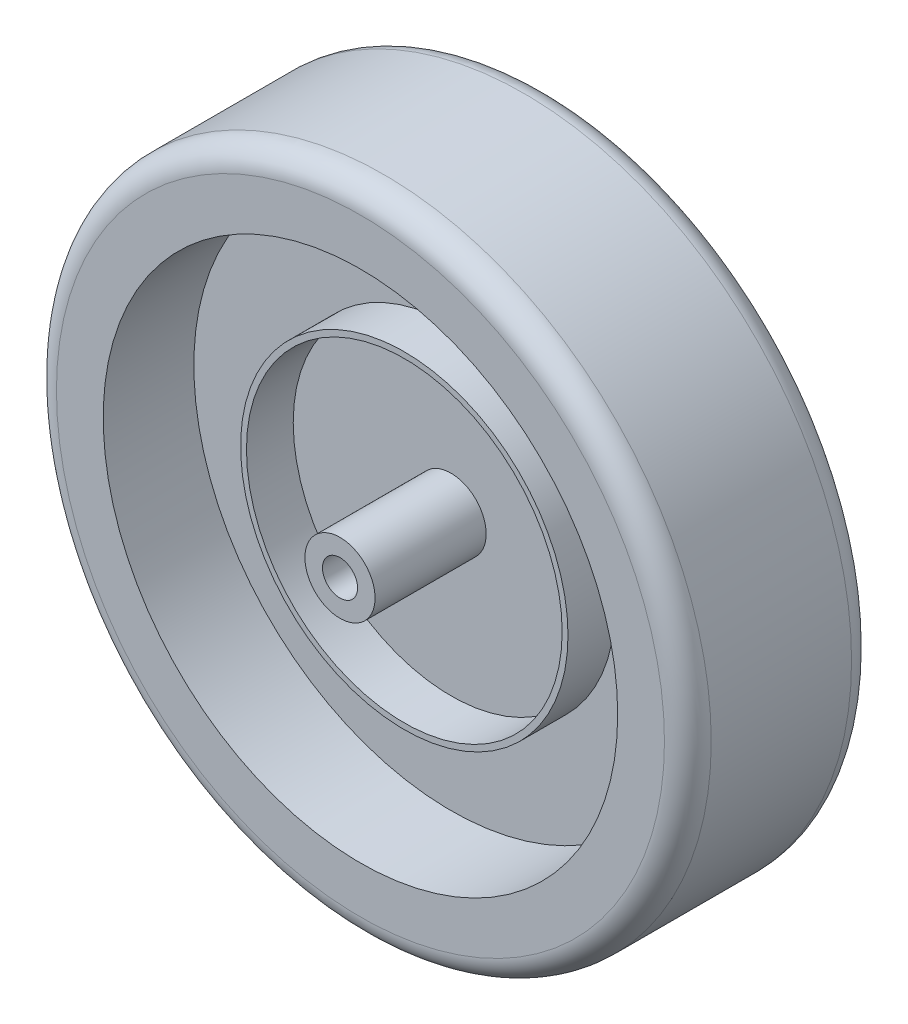
ISO-10303-21;
HEADER;
FILE_DESCRIPTION(('STEP AP214'),'2;1');
FILE_NAME('part.step','',(''),(''),'','','');
FILE_SCHEMA(('AUTOMOTIVE_DESIGN { 1 0 10303 214 1 1 1 1 }'));
ENDSEC;
DATA;
#1=APPLICATION_CONTEXT('core data for automotive mechanical design processes');
#2=APPLICATION_PROTOCOL_DEFINITION('international standard','automotive_design',2000,#1);
#3=PRODUCT_CONTEXT('',#1,'mechanical');
#4=PRODUCT('Part','Part','',(#3));
#5=PRODUCT_RELATED_PRODUCT_CATEGORY('part','',(#4));
#6=PRODUCT_DEFINITION_FORMATION('','',#4);
#7=PRODUCT_DEFINITION_CONTEXT('part definition',#1,'design');
#8=PRODUCT_DEFINITION('design','',#6,#7);
#9=PRODUCT_DEFINITION_SHAPE('','',#8);
#10=(LENGTH_UNIT() NAMED_UNIT(*) SI_UNIT(.MILLI.,.METRE.));
#11=(NAMED_UNIT(*) PLANE_ANGLE_UNIT() SI_UNIT($,.RADIAN.));
#12=(NAMED_UNIT(*) SI_UNIT($,.STERADIAN.) SOLID_ANGLE_UNIT());
#13=UNCERTAINTY_MEASURE_WITH_UNIT(LENGTH_MEASURE(1.E-05),#10,'distance_accuracy_value','');
#14=(GEOMETRIC_REPRESENTATION_CONTEXT(3) GLOBAL_UNCERTAINTY_ASSIGNED_CONTEXT((#13)) GLOBAL_UNIT_ASSIGNED_CONTEXT((#10,
#11,#12)) REPRESENTATION_CONTEXT('',''));
#15=CARTESIAN_POINT('',(0.,0.,0.));
#16=DIRECTION('',(0.,0.,1.));
#17=DIRECTION('',(1.,0.,0.));
#18=AXIS2_PLACEMENT_3D('',#15,#16,#17);
#19=CARTESIAN_POINT('',(0.,0.,0.79375));
#20=DIRECTION('',(0.,0.,1.));
#21=DIRECTION('',(1.,0.,0.));
#22=AXIS2_PLACEMENT_3D('',#19,#20,#21);
#23=PLANE('',#22);
#24=CARTESIAN_POINT('',(0.,0.,0.793749999999999));
#25=DIRECTION('',(0.,0.,1.));
#26=DIRECTION('',(1.,0.,0.));
#27=AXIS2_PLACEMENT_3D('',#24,#25,#26);
#28=CIRCLE('',#27,69.85);
#29=CARTESIAN_POINT('',(69.85,0.,0.793749999999999));
#30=VERTEX_POINT('',#29);
#31=EDGE_CURVE('E46',#30,#30,#28,.T.);
#32=ORIENTED_EDGE('',*,*,#31,.T.);
#33=EDGE_LOOP('',(#32));
#34=FACE_BOUND('',#33,.T.);
#35=CARTESIAN_POINT('',(0.,0.,0.793749999999999));
#36=DIRECTION('',(0.,0.,1.));
#37=DIRECTION('',(1.,0.,0.));
#38=AXIS2_PLACEMENT_3D('',#35,#36,#37);
#39=CIRCLE('',#38,44.45);
#40=CARTESIAN_POINT('',(44.45,0.,0.793749999999999));
#41=VERTEX_POINT('',#40);
#42=EDGE_CURVE('E51',#41,#41,#39,.F.);
#43=ORIENTED_EDGE('',*,*,#42,.T.);
#44=EDGE_LOOP('',(#43));
#45=FACE_BOUND('',#44,.T.);
#46=ADVANCED_FACE('F34',(#34,#45),#23,.T.);
#47=CARTESIAN_POINT('',(0.,0.,-0.79375));
#48=DIRECTION('',(0.,0.,1.));
#49=DIRECTION('',(1.,0.,0.));
#50=AXIS2_PLACEMENT_3D('',#47,#48,#49);
#51=PLANE('',#50);
#52=CARTESIAN_POINT('',(0.,0.,-0.79375));
#53=DIRECTION('',(0.,0.,1.));
#54=DIRECTION('',(1.,0.,0.));
#55=AXIS2_PLACEMENT_3D('',#52,#53,#54);
#56=CIRCLE('',#55,69.85);
#57=CARTESIAN_POINT('',(69.85,0.,-0.79375));
#58=VERTEX_POINT('',#57);
#59=EDGE_CURVE('E73',#58,#58,#56,.T.);
#60=ORIENTED_EDGE('',*,*,#59,.F.);
#61=EDGE_LOOP('',(#60));
#62=FACE_BOUND('',#61,.T.);
#63=CARTESIAN_POINT('',(0.,0.,-0.793749999999999));
#64=DIRECTION('',(0.,0.,1.));
#65=DIRECTION('',(1.,0.,0.));
#66=AXIS2_PLACEMENT_3D('',#63,#64,#65);
#67=CIRCLE('',#66,44.45);
#68=CARTESIAN_POINT('',(44.45,0.,-0.793749999999999));
#69=VERTEX_POINT('',#68);
#70=EDGE_CURVE('E38',#69,#69,#67,.F.);
#71=ORIENTED_EDGE('',*,*,#70,.F.);
#72=EDGE_LOOP('',(#71));
#73=FACE_BOUND('',#72,.T.);
#74=ADVANCED_FACE('F130',(#62,#73),#51,.F.);
#75=CARTESIAN_POINT('',(0.,0.,25.4));
#76=DIRECTION('',(0.,0.,-1.));
#77=DIRECTION('',(-1.,0.,0.));
#78=AXIS2_PLACEMENT_3D('',#75,#76,#77);
#79=CYLINDRICAL_SURFACE('',#78,69.85);
#80=CARTESIAN_POINT('',(0.,0.,-25.4));
#81=DIRECTION('',(0.,0.,1.));
#82=DIRECTION('',(1.,0.,0.));
#83=AXIS2_PLACEMENT_3D('',#80,#81,#82);
#84=CIRCLE('',#83,69.85);
#85=CARTESIAN_POINT('',(69.85,0.,-25.4));
#86=VERTEX_POINT('',#85);
#87=EDGE_CURVE('E76',#86,#86,#84,.T.);
#88=ORIENTED_EDGE('',*,*,#87,.F.);
#89=EDGE_LOOP('',(#88));
#90=FACE_BOUND('',#89,.T.);
#91=ORIENTED_EDGE('',*,*,#59,.T.);
#92=EDGE_LOOP('',(#91));
#93=FACE_BOUND('',#92,.T.);
#94=ADVANCED_FACE('F137',(#90,#93),#79,.F.);
#95=CARTESIAN_POINT('',(0.,0.,25.4));
#96=DIRECTION('',(0.,0.,1.));
#97=DIRECTION('',(1.,0.,0.));
#98=AXIS2_PLACEMENT_3D('',#95,#96,#97);
#99=PLANE('',#98);
#100=CARTESIAN_POINT('',(0.,0.,25.4));
#101=DIRECTION('',(0.,0.,1.));
#102=DIRECTION('',(1.,0.,0.));
#103=AXIS2_PLACEMENT_3D('',#100,#101,#102);
#104=CIRCLE('',#103,82.55);
#105=CARTESIAN_POINT('',(82.55,0.,25.4));
#106=VERTEX_POINT('',#105);
#107=EDGE_CURVE('E91',#106,#106,#104,.T.);
#108=ORIENTED_EDGE('',*,*,#107,.T.);
#109=EDGE_LOOP('',(#108));
#110=FACE_BOUND('',#109,.T.);
#111=CARTESIAN_POINT('',(0.,0.,25.4));
#112=DIRECTION('',(0.,0.,1.));
#113=DIRECTION('',(1.,0.,0.));
#114=AXIS2_PLACEMENT_3D('',#111,#112,#113);
#115=CIRCLE('',#114,69.85);
#116=CARTESIAN_POINT('',(69.85,0.,25.4));
#117=VERTEX_POINT('',#116);
#118=EDGE_CURVE('E77',#117,#117,#115,.T.);
#119=ORIENTED_EDGE('',*,*,#118,.F.);
#120=EDGE_LOOP('',(#119));
#121=FACE_BOUND('',#120,.T.);
#122=ADVANCED_FACE('F204',(#110,#121),#99,.T.);
#123=CARTESIAN_POINT('',(0.,0.,-25.4));
#124=DIRECTION('',(0.,0.,1.));
#125=DIRECTION('',(1.,0.,0.));
#126=AXIS2_PLACEMENT_3D('',#123,#124,#125);
#127=PLANE('',#126);
#128=CARTESIAN_POINT('',(0.,0.,-25.4));
#129=DIRECTION('',(0.,0.,1.));
#130=DIRECTION('',(1.,0.,0.));
#131=AXIS2_PLACEMENT_3D('',#128,#129,#130);
#132=CIRCLE('',#131,82.55);
#133=CARTESIAN_POINT('',(82.55,0.,-25.4));
#134=VERTEX_POINT('',#133);
#135=EDGE_CURVE('E88',#134,#134,#132,.F.);
#136=ORIENTED_EDGE('',*,*,#135,.T.);
#137=EDGE_LOOP('',(#136));
#138=FACE_BOUND('',#137,.T.);
#139=ORIENTED_EDGE('',*,*,#87,.T.);
#140=EDGE_LOOP('',(#139));
#141=FACE_BOUND('',#140,.T.);
#142=ADVANCED_FACE('F207',(#138,#141),#127,.F.);
#143=CARTESIAN_POINT('',(0.,0.,25.4));
#144=DIRECTION('',(0.,0.,-1.));
#145=DIRECTION('',(-1.,0.,0.));
#146=AXIS2_PLACEMENT_3D('',#143,#144,#145);
#147=CYLINDRICAL_SURFACE('',#146,88.9);
#148=CARTESIAN_POINT('',(0.,0.,-19.05));
#149=DIRECTION('',(0.,0.,1.));
#150=DIRECTION('',(1.,0.,0.));
#151=AXIS2_PLACEMENT_3D('',#148,#149,#150);
#152=CIRCLE('',#151,88.9);
#153=CARTESIAN_POINT('',(88.9,0.,-19.05));
#154=VERTEX_POINT('',#153);
#155=EDGE_CURVE('E85',#154,#154,#152,.T.);
#156=ORIENTED_EDGE('',*,*,#155,.T.);
#157=EDGE_LOOP('',(#156));
#158=FACE_BOUND('',#157,.T.);
#159=CARTESIAN_POINT('',(0.,0.,19.05));
#160=DIRECTION('',(0.,0.,1.));
#161=DIRECTION('',(1.,0.,0.));
#162=AXIS2_PLACEMENT_3D('',#159,#160,#161);
#163=CIRCLE('',#162,88.9);
#164=CARTESIAN_POINT('',(88.9,0.,19.05));
#165=VERTEX_POINT('',#164);
#166=EDGE_CURVE('E80',#165,#165,#163,.F.);
#167=ORIENTED_EDGE('',*,*,#166,.T.);
#168=EDGE_LOOP('',(#167));
#169=FACE_BOUND('',#168,.T.);
#170=ADVANCED_FACE('F212',(#158,#169),#147,.T.);
#171=ORIENTED_EDGE('',*,*,#31,.F.);
#172=EDGE_LOOP('',(#171));
#173=FACE_BOUND('',#172,.T.);
#174=ORIENTED_EDGE('',*,*,#118,.T.);
#175=EDGE_LOOP('',(#174));
#176=FACE_BOUND('',#175,.T.);
#177=ADVANCED_FACE('F198',(#173,#176),#79,.F.);
#178=CARTESIAN_POINT('',(0.,0.,-19.05));
#179=DIRECTION('',(0.,0.,1.));
#180=DIRECTION('',(1.,0.,0.));
#181=AXIS2_PLACEMENT_3D('',#178,#179,#180);
#182=TOROIDAL_SURFACE('',#181,82.55,6.35);
#183=ORIENTED_EDGE('',*,*,#135,.F.);
#184=EDGE_LOOP('',(#183));
#185=FACE_BOUND('',#184,.T.);
#186=ORIENTED_EDGE('',*,*,#155,.F.);
#187=EDGE_LOOP('',(#186));
#188=FACE_BOUND('',#187,.T.);
#189=ADVANCED_FACE('F193',(#185,#188),#182,.T.);
#190=CARTESIAN_POINT('',(0.,0.,19.05));
#191=DIRECTION('',(0.,0.,1.));
#192=DIRECTION('',(1.,0.,0.));
#193=AXIS2_PLACEMENT_3D('',#190,#191,#192);
#194=TOROIDAL_SURFACE('',#193,82.55,6.35);
#195=ORIENTED_EDGE('',*,*,#166,.F.);
#196=EDGE_LOOP('',(#195));
#197=FACE_BOUND('',#196,.T.);
#198=ORIENTED_EDGE('',*,*,#107,.F.);
#199=EDGE_LOOP('',(#198));
#200=FACE_BOUND('',#199,.T.);
#201=ADVANCED_FACE('F36',(#197,#200),#194,.T.);
#202=CARTESIAN_POINT('',(0.,0.,13.49375));
#203=DIRECTION('',(0.,0.,-1.));
#204=DIRECTION('',(-1.,0.,0.));
#205=AXIS2_PLACEMENT_3D('',#202,#203,#204);
#206=CYLINDRICAL_SURFACE('',#205,44.45);
#207=CARTESIAN_POINT('',(0.,0.,-11.90625));
#208=DIRECTION('',(0.,0.,1.));
#209=DIRECTION('',(1.,0.,0.));
#210=AXIS2_PLACEMENT_3D('',#207,#208,#209);
#211=CIRCLE('',#210,44.45);
#212=CARTESIAN_POINT('',(44.45,0.,-11.90625));
#213=VERTEX_POINT('',#212);
#214=EDGE_CURVE('E49',#213,#213,#211,.T.);
#215=ORIENTED_EDGE('',*,*,#214,.T.);
#216=EDGE_LOOP('',(#215));
#217=FACE_BOUND('',#216,.T.);
#218=ORIENTED_EDGE('',*,*,#70,.T.);
#219=EDGE_LOOP('',(#218));
#220=FACE_BOUND('',#219,.T.);
#221=ADVANCED_FACE('F124',(#217,#220),#206,.T.);
#222=CARTESIAN_POINT('',(0.,0.,-11.90625));
#223=DIRECTION('',(0.,0.,1.));
#224=DIRECTION('',(1.,0.,0.));
#225=AXIS2_PLACEMENT_3D('',#222,#223,#224);
#226=PLANE('',#225);
#227=ORIENTED_EDGE('',*,*,#214,.F.);
#228=EDGE_LOOP('',(#227));
#229=FACE_BOUND('',#228,.T.);
#230=CARTESIAN_POINT('',(0.,0.,-11.90625));
#231=DIRECTION('',(0.,0.,1.));
#232=DIRECTION('',(1.,0.,0.));
#233=AXIS2_PLACEMENT_3D('',#230,#231,#232);
#234=CIRCLE('',#233,42.8625);
#235=CARTESIAN_POINT('',(42.8625,0.,-11.90625));
#236=VERTEX_POINT('',#235);
#237=EDGE_CURVE('E105',#236,#236,#234,.T.);
#238=ORIENTED_EDGE('',*,*,#237,.T.);
#239=EDGE_LOOP('',(#238));
#240=FACE_BOUND('',#239,.T.);
#241=ADVANCED_FACE('F125',(#229,#240),#226,.F.);
#242=CARTESIAN_POINT('',(0.,0.,13.49375));
#243=DIRECTION('',(0.,0.,-1.));
#244=DIRECTION('',(-1.,0.,0.));
#245=AXIS2_PLACEMENT_3D('',#242,#243,#244);
#246=CYLINDRICAL_SURFACE('',#245,42.8625);
#247=ORIENTED_EDGE('',*,*,#237,.F.);
#248=EDGE_LOOP('',(#247));
#249=FACE_BOUND('',#248,.T.);
#250=CARTESIAN_POINT('',(0.,0.,-0.793749999999999));
#251=DIRECTION('',(0.,0.,1.));
#252=DIRECTION('',(1.,0.,0.));
#253=AXIS2_PLACEMENT_3D('',#250,#251,#252);
#254=CIRCLE('',#253,42.8625);
#255=CARTESIAN_POINT('',(42.8625,0.,-0.793749999999999));
#256=VERTEX_POINT('',#255);
#257=EDGE_CURVE('E55',#256,#256,#254,.F.);
#258=ORIENTED_EDGE('',*,*,#257,.F.);
#259=EDGE_LOOP('',(#258));
#260=FACE_BOUND('',#259,.T.);
#261=ADVANCED_FACE('F116',(#249,#260),#246,.F.);
#262=CARTESIAN_POINT('',(0.,0.,13.49375));
#263=DIRECTION('',(0.,0.,1.));
#264=DIRECTION('',(1.,0.,0.));
#265=AXIS2_PLACEMENT_3D('',#262,#263,#264);
#266=PLANE('',#265);
#267=CARTESIAN_POINT('',(0.,0.,13.49375));
#268=DIRECTION('',(0.,0.,1.));
#269=DIRECTION('',(1.,0.,0.));
#270=AXIS2_PLACEMENT_3D('',#267,#268,#269);
#271=CIRCLE('',#270,44.45);
#272=CARTESIAN_POINT('',(44.45,0.,13.49375));
#273=VERTEX_POINT('',#272);
#274=EDGE_CURVE('E96',#273,#273,#271,.T.);
#275=ORIENTED_EDGE('',*,*,#274,.T.);
#276=EDGE_LOOP('',(#275));
#277=FACE_BOUND('',#276,.T.);
#278=CARTESIAN_POINT('',(0.,0.,13.49375));
#279=DIRECTION('',(0.,0.,1.));
#280=DIRECTION('',(1.,0.,0.));
#281=AXIS2_PLACEMENT_3D('',#278,#279,#280);
#282=CIRCLE('',#281,42.8625);
#283=CARTESIAN_POINT('',(42.8625,0.,13.49375));
#284=VERTEX_POINT('',#283);
#285=EDGE_CURVE('E103',#284,#284,#282,.T.);
#286=ORIENTED_EDGE('',*,*,#285,.F.);
#287=EDGE_LOOP('',(#286));
#288=FACE_BOUND('',#287,.T.);
#289=ADVANCED_FACE('F113',(#277,#288),#266,.T.);
#290=ORIENTED_EDGE('',*,*,#42,.F.);
#291=EDGE_LOOP('',(#290));
#292=FACE_BOUND('',#291,.T.);
#293=ORIENTED_EDGE('',*,*,#274,.F.);
#294=EDGE_LOOP('',(#293));
#295=FACE_BOUND('',#294,.T.);
#296=ADVANCED_FACE('F115',(#292,#295),#206,.T.);
#297=CARTESIAN_POINT('',(0.,0.,0.793749999999999));
#298=DIRECTION('',(0.,0.,1.));
#299=DIRECTION('',(1.,0.,0.));
#300=AXIS2_PLACEMENT_3D('',#297,#298,#299);
#301=CIRCLE('',#300,42.8625);
#302=CARTESIAN_POINT('',(42.8625,0.,0.793749999999999));
#303=VERTEX_POINT('',#302);
#304=EDGE_CURVE('E10',#303,#303,#301,.F.);
#305=ORIENTED_EDGE('',*,*,#304,.T.);
#306=EDGE_LOOP('',(#305));
#307=FACE_BOUND('',#306,.T.);
#308=ORIENTED_EDGE('',*,*,#285,.T.);
#309=EDGE_LOOP('',(#308));
#310=FACE_BOUND('',#309,.T.);
#311=ADVANCED_FACE('F111',(#307,#310),#246,.F.);
#312=CARTESIAN_POINT('',(0.,0.,30.95625));
#313=DIRECTION('',(0.,0.,1.));
#314=DIRECTION('',(1.,0.,0.));
#315=AXIS2_PLACEMENT_3D('',#312,#313,#314);
#316=PLANE('',#315);
#317=CARTESIAN_POINT('',(0.,0.,30.95625));
#318=DIRECTION('',(0.,0.,1.));
#319=DIRECTION('',(1.,0.,0.));
#320=AXIS2_PLACEMENT_3D('',#317,#318,#319);
#321=CIRCLE('',#320,9.525);
#322=CARTESIAN_POINT('',(-9.525,0.,30.95625));
#323=VERTEX_POINT('',#322);
#324=EDGE_CURVE('E62',#323,#323,#321,.T.);
#325=ORIENTED_EDGE('',*,*,#324,.T.);
#326=EDGE_LOOP('',(#325));
#327=FACE_BOUND('',#326,.T.);
#328=CARTESIAN_POINT('',(0.,0.,30.95625));
#329=DIRECTION('',(0.,0.,1.));
#330=DIRECTION('',(1.,0.,0.));
#331=AXIS2_PLACEMENT_3D('',#328,#329,#330);
#332=CIRCLE('',#331,4.7625);
#333=CARTESIAN_POINT('',(-4.7625,0.,30.95625));
#334=VERTEX_POINT('',#333);
#335=EDGE_CURVE('E56',#334,#334,#332,.T.);
#336=ORIENTED_EDGE('',*,*,#335,.F.);
#337=EDGE_LOOP('',(#336));
#338=FACE_BOUND('',#337,.T.);
#339=ADVANCED_FACE('F154',(#327,#338),#316,.T.);
#340=CARTESIAN_POINT('',(0.,0.,30.95625));
#341=DIRECTION('',(0.,0.,-1.));
#342=DIRECTION('',(-1.,0.,0.));
#343=AXIS2_PLACEMENT_3D('',#340,#341,#342);
#344=CYLINDRICAL_SURFACE('',#343,9.525);
#345=CARTESIAN_POINT('',(0.,0.,0.79375));
#346=DIRECTION('',(0.,0.,1.));
#347=DIRECTION('',(1.,0.,0.));
#348=AXIS2_PLACEMENT_3D('',#345,#346,#347);
#349=CIRCLE('',#348,9.525);
#350=CARTESIAN_POINT('',(-9.525,0.,0.793749999999999));
#351=VERTEX_POINT('',#350);
#352=EDGE_CURVE('E70',#351,#351,#349,.T.);
#353=CARTESIAN_POINT('',(-9.525,0.,0.793749999999999));
#354=CARTESIAN_POINT('',(-9.525,0.,1.10794270833333));
#355=CARTESIAN_POINT('',(-9.525,0.,1.42213541666667));
#356=CARTESIAN_POINT('',(-9.525,0.,2.05052083333333));
#357=CARTESIAN_POINT('',(-9.525,0.,2.36471354166666));
#358=CARTESIAN_POINT('',(-9.525,0.,2.99309895833333));
#359=CARTESIAN_POINT('',(-9.525,0.,3.30729166666667));
#360=CARTESIAN_POINT('',(-9.525,0.,3.93567708333333));
#361=CARTESIAN_POINT('',(-9.525,0.,4.24986979166667));
#362=CARTESIAN_POINT('',(-9.525,0.,4.87825520833333));
#363=CARTESIAN_POINT('',(-9.525,0.,5.19244791666667));
#364=CARTESIAN_POINT('',(-9.525,0.,5.82083333333333));
#365=CARTESIAN_POINT('',(-9.525,0.,6.13502604166667));
#366=CARTESIAN_POINT('',(-9.525,0.,6.76341145833333));
#367=CARTESIAN_POINT('',(-9.525,0.,7.07760416666667));
#368=CARTESIAN_POINT('',(-9.525,0.,7.70598958333333));
#369=CARTESIAN_POINT('',(-9.525,0.,8.02018229166667));
#370=CARTESIAN_POINT('',(-9.525,0.,8.64856770833333));
#371=CARTESIAN_POINT('',(-9.525,0.,8.96276041666667));
#372=CARTESIAN_POINT('',(-9.525,0.,9.59114583333333));
#373=CARTESIAN_POINT('',(-9.525,0.,9.90533854166667));
#374=CARTESIAN_POINT('',(-9.525,0.,10.5337239583333));
#375=CARTESIAN_POINT('',(-9.525,0.,10.8479166666667));
#376=CARTESIAN_POINT('',(-9.525,0.,11.4763020833333));
#377=CARTESIAN_POINT('',(-9.525,0.,11.7904947916667));
#378=CARTESIAN_POINT('',(-9.525,0.,12.4188802083333));
#379=CARTESIAN_POINT('',(-9.525,0.,12.7330729166667));
#380=CARTESIAN_POINT('',(-9.525,0.,13.3614583333333));
#381=CARTESIAN_POINT('',(-9.525,0.,13.6756510416667));
#382=CARTESIAN_POINT('',(-9.525,0.,14.3040364583333));
#383=CARTESIAN_POINT('',(-9.525,0.,14.6182291666667));
#384=CARTESIAN_POINT('',(-9.525,0.,15.2466145833333));
#385=CARTESIAN_POINT('',(-9.525,0.,15.5608072916667));
#386=CARTESIAN_POINT('',(-9.525,0.,16.1891927083333));
#387=CARTESIAN_POINT('',(-9.525,0.,16.5033854166667));
#388=CARTESIAN_POINT('',(-9.525,0.,17.1317708333333));
#389=CARTESIAN_POINT('',(-9.525,0.,17.4459635416667));
#390=CARTESIAN_POINT('',(-9.525,0.,18.0743489583333));
#391=CARTESIAN_POINT('',(-9.525,0.,18.3885416666667));
#392=CARTESIAN_POINT('',(-9.525,0.,19.0169270833333));
#393=CARTESIAN_POINT('',(-9.525,0.,19.3311197916667));
#394=CARTESIAN_POINT('',(-9.525,0.,19.9595052083333));
#395=CARTESIAN_POINT('',(-9.525,0.,20.2736979166667));
#396=CARTESIAN_POINT('',(-9.525,0.,20.9020833333333));
#397=CARTESIAN_POINT('',(-9.525,0.,21.2162760416667));
#398=CARTESIAN_POINT('',(-9.525,0.,21.8446614583333));
#399=CARTESIAN_POINT('',(-9.525,0.,22.1588541666667));
#400=CARTESIAN_POINT('',(-9.525,0.,22.7872395833333));
#401=CARTESIAN_POINT('',(-9.525,0.,23.1014322916667));
#402=CARTESIAN_POINT('',(-9.525,0.,23.7298177083333));
#403=CARTESIAN_POINT('',(-9.525,0.,24.0440104166667));
#404=CARTESIAN_POINT('',(-9.525,0.,24.6723958333333));
#405=CARTESIAN_POINT('',(-9.525,0.,24.9865885416667));
#406=CARTESIAN_POINT('',(-9.525,0.,25.6149739583333));
#407=CARTESIAN_POINT('',(-9.525,0.,25.9291666666667));
#408=CARTESIAN_POINT('',(-9.525,0.,26.5575520833333));
#409=CARTESIAN_POINT('',(-9.525,0.,26.8717447916667));
#410=CARTESIAN_POINT('',(-9.525,0.,27.5001302083333));
#411=CARTESIAN_POINT('',(-9.525,0.,27.8143229166667));
#412=CARTESIAN_POINT('',(-9.525,0.,28.4427083333333));
#413=CARTESIAN_POINT('',(-9.525,0.,28.7569010416667));
#414=CARTESIAN_POINT('',(-9.525,0.,29.3852864583333));
#415=CARTESIAN_POINT('',(-9.525,0.,29.6994791666667));
#416=CARTESIAN_POINT('',(-9.525,0.,30.3278645833333));
#417=CARTESIAN_POINT('',(-9.525,0.,30.6420572916667));
#418=CARTESIAN_POINT('',(-9.525,0.,30.95625));
#419=B_SPLINE_CURVE_WITH_KNOTS('',3,(#353,#354,#355,#356,#357,#358,#359,#360,#361,#362,#363,
#364,#365,#366,#367,#368,#369,#370,#371,#372,#373,#374,#375,#376,#377,#378,#379,#380,#381,#382,
#383,#384,#385,#386,#387,#388,#389,#390,#391,#392,#393,#394,#395,#396,#397,#398,#399,#400,#401,
#402,#403,#404,#405,#406,#407,#408,#409,#410,#411,#412,#413,#414,#415,#416,#417,#418),
.UNSPECIFIED.,.F.,.F.,(4,2,2,2,2,2,2,2,2,2,2,2,2,2,2,2,2,2,2,2,2,2,2,2,2,2,2,2,2,2,2,2,4),(0.,
0.942578124999999,1.88515625,2.827734375,3.7703125,4.712890625,5.65546875,6.598046875,7.540625,
8.483203125,9.42578125,10.368359375,11.3109375,12.253515625,13.19609375,14.138671875,15.08125,
16.023828125,16.96640625,17.908984375,18.8515625,19.794140625,20.73671875,21.679296875,
22.621875,23.564453125,24.50703125,25.449609375,26.3921875,27.334765625,28.27734375,
29.219921875,30.1625),.UNSPECIFIED.);
#420=EDGE_CURVE('BSEAM145',#351,#323,#419,.T.);
#421=ORIENTED_EDGE('',*,*,#352,.T.);
#422=ORIENTED_EDGE('',*,*,#324,.F.);
#423=ORIENTED_EDGE('',*,*,#420,.T.);
#424=ORIENTED_EDGE('',*,*,#420,.F.);
#425=EDGE_LOOP('',(#421,#423,#422,#424));
#426=FACE_BOUND('',#425,.T.);
#427=ADVANCED_FACE('F145',(#426),#344,.T.);
#428=ORIENTED_EDGE('',*,*,#304,.F.);
#429=EDGE_LOOP('',(#428));
#430=FACE_BOUND('',#429,.T.);
#431=ORIENTED_EDGE('',*,*,#352,.F.);
#432=EDGE_LOOP('',(#431));
#433=FACE_BOUND('',#432,.T.);
#434=ADVANCED_FACE('F133',(#430,#433),#23,.T.);
#435=CARTESIAN_POINT('',(0.,0.,30.95625));
#436=DIRECTION('',(0.,0.,-1.));
#437=DIRECTION('',(-1.,0.,0.));
#438=AXIS2_PLACEMENT_3D('',#435,#436,#437);
#439=CYLINDRICAL_SURFACE('',#438,4.7625);
#440=CARTESIAN_POINT('',(0.,0.,-29.36875));
#441=DIRECTION('',(0.,0.,1.));
#442=DIRECTION('',(1.,0.,0.));
#443=AXIS2_PLACEMENT_3D('',#440,#441,#442);
#444=CIRCLE('',#443,4.7625);
#445=CARTESIAN_POINT('',(-4.7625,0.,-29.36875));
#446=VERTEX_POINT('',#445);
#447=EDGE_CURVE('E54',#446,#446,#444,.T.);
#448=CARTESIAN_POINT('',(-4.7625,0.,30.95625));
#449=CARTESIAN_POINT('',(-4.7625,0.,30.3278645833333));
#450=CARTESIAN_POINT('',(-4.7625,0.,29.6994791666667));
#451=CARTESIAN_POINT('',(-4.7625,0.,28.4427083333333));
#452=CARTESIAN_POINT('',(-4.7625,0.,27.8143229166667));
#453=CARTESIAN_POINT('',(-4.7625,0.,26.5575520833333));
#454=CARTESIAN_POINT('',(-4.7625,0.,25.9291666666667));
#455=CARTESIAN_POINT('',(-4.7625,0.,24.6723958333333));
#456=CARTESIAN_POINT('',(-4.7625,0.,24.0440104166667));
#457=CARTESIAN_POINT('',(-4.7625,0.,22.7872395833333));
#458=CARTESIAN_POINT('',(-4.7625,0.,22.1588541666667));
#459=CARTESIAN_POINT('',(-4.7625,0.,20.9020833333333));
#460=CARTESIAN_POINT('',(-4.7625,0.,20.2736979166667));
#461=CARTESIAN_POINT('',(-4.7625,0.,19.0169270833333));
#462=CARTESIAN_POINT('',(-4.7625,0.,18.3885416666667));
#463=CARTESIAN_POINT('',(-4.7625,0.,17.1317708333333));
#464=CARTESIAN_POINT('',(-4.7625,0.,16.5033854166667));
#465=CARTESIAN_POINT('',(-4.7625,0.,15.2466145833333));
#466=CARTESIAN_POINT('',(-4.7625,0.,14.6182291666667));
#467=CARTESIAN_POINT('',(-4.7625,0.,13.3614583333333));
#468=CARTESIAN_POINT('',(-4.7625,0.,12.7330729166667));
#469=CARTESIAN_POINT('',(-4.7625,0.,11.4763020833333));
#470=CARTESIAN_POINT('',(-4.7625,0.,10.8479166666667));
#471=CARTESIAN_POINT('',(-4.7625,0.,9.59114583333333));
#472=CARTESIAN_POINT('',(-4.7625,0.,8.96276041666667));
#473=CARTESIAN_POINT('',(-4.7625,0.,7.70598958333333));
#474=CARTESIAN_POINT('',(-4.7625,0.,7.07760416666666));
#475=CARTESIAN_POINT('',(-4.7625,0.,5.82083333333333));
#476=CARTESIAN_POINT('',(-4.7625,0.,5.19244791666666));
#477=CARTESIAN_POINT('',(-4.7625,0.,3.93567708333333));
#478=CARTESIAN_POINT('',(-4.7625,0.,3.30729166666666));
#479=CARTESIAN_POINT('',(-4.7625,0.,2.05052083333333));
#480=CARTESIAN_POINT('',(-4.7625,0.,1.42213541666666));
#481=CARTESIAN_POINT('',(-4.7625,0.,0.165364583333332));
#482=CARTESIAN_POINT('',(-4.7625,0.,-0.463020833333332));
#483=CARTESIAN_POINT('',(-4.7625,0.,-1.71979166666666));
#484=CARTESIAN_POINT('',(-4.7625,0.,-2.34817708333333));
#485=CARTESIAN_POINT('',(-4.7625,0.,-3.60494791666666));
#486=CARTESIAN_POINT('',(-4.7625,0.,-4.23333333333333));
#487=CARTESIAN_POINT('',(-4.7625,0.,-5.49010416666667));
#488=CARTESIAN_POINT('',(-4.7625,0.,-6.11848958333333));
#489=CARTESIAN_POINT('',(-4.7625,0.,-7.37526041666667));
#490=CARTESIAN_POINT('',(-4.7625,0.,-8.00364583333333));
#491=CARTESIAN_POINT('',(-4.7625,0.,-9.26041666666666));
#492=CARTESIAN_POINT('',(-4.7625,0.,-9.88880208333333));
#493=CARTESIAN_POINT('',(-4.7625,0.,-11.1455729166667));
#494=CARTESIAN_POINT('',(-4.7625,0.,-11.7739583333333));
#495=CARTESIAN_POINT('',(-4.7625,0.,-13.0307291666667));
#496=CARTESIAN_POINT('',(-4.7625,0.,-13.6591145833333));
#497=CARTESIAN_POINT('',(-4.7625,0.,-14.9158854166667));
#498=CARTESIAN_POINT('',(-4.7625,0.,-15.5442708333333));
#499=CARTESIAN_POINT('',(-4.7625,0.,-16.8010416666667));
#500=CARTESIAN_POINT('',(-4.7625,0.,-17.4294270833333));
#501=CARTESIAN_POINT('',(-4.7625,0.,-18.6861979166667));
#502=CARTESIAN_POINT('',(-4.7625,0.,-19.3145833333333));
#503=CARTESIAN_POINT('',(-4.7625,0.,-20.5713541666667));
#504=CARTESIAN_POINT('',(-4.7625,0.,-21.1997395833333));
#505=CARTESIAN_POINT('',(-4.7625,0.,-22.4565104166667));
#506=CARTESIAN_POINT('',(-4.7625,0.,-23.0848958333333));
#507=CARTESIAN_POINT('',(-4.7625,0.,-24.3416666666667));
#508=CARTESIAN_POINT('',(-4.7625,0.,-24.9700520833333));
#509=CARTESIAN_POINT('',(-4.7625,0.,-26.2268229166667));
#510=CARTESIAN_POINT('',(-4.7625,0.,-26.8552083333333));
#511=CARTESIAN_POINT('',(-4.7625,0.,-28.1119791666667));
#512=CARTESIAN_POINT('',(-4.7625,0.,-28.7403645833333));
#513=CARTESIAN_POINT('',(-4.7625,0.,-29.36875));
#514=B_SPLINE_CURVE_WITH_KNOTS('',3,(#448,#449,#450,#451,#452,#453,#454,#455,#456,#457,#458,
#459,#460,#461,#462,#463,#464,#465,#466,#467,#468,#469,#470,#471,#472,#473,#474,#475,#476,#477,
#478,#479,#480,#481,#482,#483,#484,#485,#486,#487,#488,#489,#490,#491,#492,#493,#494,#495,#496,
#497,#498,#499,#500,#501,#502,#503,#504,#505,#506,#507,#508,#509,#510,#511,#512,#513),
.UNSPECIFIED.,.F.,.F.,(4,2,2,2,2,2,2,2,2,2,2,2,2,2,2,2,2,2,2,2,2,2,2,2,2,2,2,2,2,2,2,2,4),(0.,
1.88515625,3.7703125,5.65546875,7.540625,9.42578125,11.3109375,13.19609375,15.08125,16.96640625,
18.8515625,20.73671875,22.621875,24.50703125,26.3921875,28.27734375,30.1625,32.04765625,
33.9328125,35.81796875,37.703125,39.58828125,41.4734375,43.35859375,45.24375,47.12890625,
49.0140625,50.89921875,52.784375,54.66953125,56.5546875,58.43984375,60.325),.UNSPECIFIED.);
#515=EDGE_CURVE('BSEAM144',#334,#446,#514,.T.);
#516=ORIENTED_EDGE('',*,*,#335,.T.);
#517=ORIENTED_EDGE('',*,*,#447,.F.);
#518=ORIENTED_EDGE('',*,*,#515,.T.);
#519=ORIENTED_EDGE('',*,*,#515,.F.);
#520=EDGE_LOOP('',(#516,#518,#517,#519));
#521=FACE_BOUND('',#520,.T.);
#522=ADVANCED_FACE('F144',(#521),#439,.F.);
#523=CARTESIAN_POINT('',(0.,0.,-29.36875));
#524=DIRECTION('',(0.,0.,1.));
#525=DIRECTION('',(1.,0.,0.));
#526=AXIS2_PLACEMENT_3D('',#523,#524,#525);
#527=PLANE('',#526);
#528=CARTESIAN_POINT('',(0.,0.,-29.36875));
#529=DIRECTION('',(0.,0.,1.));
#530=DIRECTION('',(1.,0.,0.));
#531=AXIS2_PLACEMENT_3D('',#528,#529,#530);
#532=CIRCLE('',#531,9.525);
#533=CARTESIAN_POINT('',(-9.525,0.,-29.36875));
#534=VERTEX_POINT('',#533);
#535=EDGE_CURVE('E59',#534,#534,#532,.T.);
#536=ORIENTED_EDGE('',*,*,#535,.F.);
#537=EDGE_LOOP('',(#536));
#538=FACE_BOUND('',#537,.T.);
#539=ORIENTED_EDGE('',*,*,#447,.T.);
#540=EDGE_LOOP('',(#539));
#541=FACE_BOUND('',#540,.T.);
#542=ADVANCED_FACE('F151',(#538,#541),#527,.F.);
#543=CARTESIAN_POINT('',(0.,0.,-0.793750000000003));
#544=DIRECTION('',(0.,0.,1.));
#545=DIRECTION('',(1.,0.,0.));
#546=AXIS2_PLACEMENT_3D('',#543,#544,#545);
#547=CIRCLE('',#546,9.525);
#548=CARTESIAN_POINT('',(-9.525,0.,-0.79375000000001));
#549=VERTEX_POINT('',#548);
#550=EDGE_CURVE('E65',#549,#549,#547,.F.);
#551=CARTESIAN_POINT('',(-9.525,0.,-29.36875));
#552=CARTESIAN_POINT('',(-9.525,0.,-29.07109375));
#553=CARTESIAN_POINT('',(-9.525,0.,-28.7734375));
#554=CARTESIAN_POINT('',(-9.525,0.,-28.178125));
#555=CARTESIAN_POINT('',(-9.525,0.,-27.88046875));
#556=CARTESIAN_POINT('',(-9.525,0.,-27.28515625));
#557=CARTESIAN_POINT('',(-9.525,0.,-26.9875));
#558=CARTESIAN_POINT('',(-9.525,0.,-26.3921875));
#559=CARTESIAN_POINT('',(-9.525,0.,-26.09453125));
#560=CARTESIAN_POINT('',(-9.525,0.,-25.49921875));
#561=CARTESIAN_POINT('',(-9.525,0.,-25.2015625));
#562=CARTESIAN_POINT('',(-9.525,0.,-24.60625));
#563=CARTESIAN_POINT('',(-9.525,0.,-24.30859375));
#564=CARTESIAN_POINT('',(-9.525,0.,-23.71328125));
#565=CARTESIAN_POINT('',(-9.525,0.,-23.415625));
#566=CARTESIAN_POINT('',(-9.525,0.,-22.8203125));
#567=CARTESIAN_POINT('',(-9.525,0.,-22.52265625));
#568=CARTESIAN_POINT('',(-9.525,0.,-21.92734375));
#569=CARTESIAN_POINT('',(-9.525,0.,-21.6296875));
#570=CARTESIAN_POINT('',(-9.525,0.,-21.034375));
#571=CARTESIAN_POINT('',(-9.525,0.,-20.73671875));
#572=CARTESIAN_POINT('',(-9.525,0.,-20.14140625));
#573=CARTESIAN_POINT('',(-9.525,0.,-19.84375));
#574=CARTESIAN_POINT('',(-9.525,0.,-19.2484375));
#575=CARTESIAN_POINT('',(-9.525,0.,-18.95078125));
#576=CARTESIAN_POINT('',(-9.525,0.,-18.35546875));
#577=CARTESIAN_POINT('',(-9.525,0.,-18.0578125));
#578=CARTESIAN_POINT('',(-9.525,0.,-17.4625));
#579=CARTESIAN_POINT('',(-9.525,0.,-17.16484375));
#580=CARTESIAN_POINT('',(-9.525,0.,-16.56953125));
#581=CARTESIAN_POINT('',(-9.525,0.,-16.271875));
#582=CARTESIAN_POINT('',(-9.525,0.,-15.6765625));
#583=CARTESIAN_POINT('',(-9.525,0.,-15.37890625));
#584=CARTESIAN_POINT('',(-9.525,0.,-14.78359375));
#585=CARTESIAN_POINT('',(-9.525,0.,-14.4859375));
#586=CARTESIAN_POINT('',(-9.525,0.,-13.890625));
#587=CARTESIAN_POINT('',(-9.525,0.,-13.59296875));
#588=CARTESIAN_POINT('',(-9.525,0.,-12.99765625));
#589=CARTESIAN_POINT('',(-9.525,0.,-12.7));
#590=CARTESIAN_POINT('',(-9.525,0.,-12.1046875));
#591=CARTESIAN_POINT('',(-9.525,0.,-11.80703125));
#592=CARTESIAN_POINT('',(-9.525,0.,-11.21171875));
#593=CARTESIAN_POINT('',(-9.525,0.,-10.9140625));
#594=CARTESIAN_POINT('',(-9.525,0.,-10.31875));
#595=CARTESIAN_POINT('',(-9.525,0.,-10.02109375));
#596=CARTESIAN_POINT('',(-9.525,0.,-9.42578125000001));
#597=CARTESIAN_POINT('',(-9.525,0.,-9.12812500000001));
#598=CARTESIAN_POINT('',(-9.525,0.,-8.53281250000001));
#599=CARTESIAN_POINT('',(-9.525,0.,-8.23515625000001));
#600=CARTESIAN_POINT('',(-9.525,0.,-7.63984375000001));
#601=CARTESIAN_POINT('',(-9.525,0.,-7.34218750000001));
#602=CARTESIAN_POINT('',(-9.525,0.,-6.74687500000001));
#603=CARTESIAN_POINT('',(-9.525,0.,-6.44921875000001));
#604=CARTESIAN_POINT('',(-9.525,0.,-5.85390625000001));
#605=CARTESIAN_POINT('',(-9.525,0.,-5.55625000000001));
#606=CARTESIAN_POINT('',(-9.525,0.,-4.96093750000001));
#607=CARTESIAN_POINT('',(-9.525,0.,-4.66328125000001));
#608=CARTESIAN_POINT('',(-9.525,0.,-4.06796875000001));
#609=CARTESIAN_POINT('',(-9.525,0.,-3.77031250000001));
#610=CARTESIAN_POINT('',(-9.525,0.,-3.17500000000001));
#611=CARTESIAN_POINT('',(-9.525,0.,-2.87734375000001));
#612=CARTESIAN_POINT('',(-9.525,0.,-2.28203125000001));
#613=CARTESIAN_POINT('',(-9.525,0.,-1.98437500000001));
#614=CARTESIAN_POINT('',(-9.525,0.,-1.38906250000001));
#615=CARTESIAN_POINT('',(-9.525,0.,-1.09140625000001));
#616=CARTESIAN_POINT('',(-9.525,0.,-0.79375000000001));
#617=B_SPLINE_CURVE_WITH_KNOTS('',3,(#551,#552,#553,#554,#555,#556,#557,#558,#559,#560,#561,
#562,#563,#564,#565,#566,#567,#568,#569,#570,#571,#572,#573,#574,#575,#576,#577,#578,#579,#580,
#581,#582,#583,#584,#585,#586,#587,#588,#589,#590,#591,#592,#593,#594,#595,#596,#597,#598,#599,
#600,#601,#602,#603,#604,#605,#606,#607,#608,#609,#610,#611,#612,#613,#614,#615,#616),
.UNSPECIFIED.,.F.,.F.,(4,2,2,2,2,2,2,2,2,2,2,2,2,2,2,2,2,2,2,2,2,2,2,2,2,2,2,2,2,2,2,2,4),(0.,
0.892968750000001,1.7859375,2.67890625,3.571875,4.46484375,5.3578125,6.25078125,7.14375,
8.03671875,8.9296875,9.82265624999999,10.715625,11.60859375,12.5015625,13.39453125,14.2875,
15.18046875,16.0734375,16.96640625,17.859375,18.75234375,19.6453125,20.53828125,21.43125,
22.32421875,23.2171875,24.11015625,25.003125,25.89609375,26.7890625,27.68203125,28.575),.UNSPECIFIED.);
#618=EDGE_CURVE('BSEAM156',#534,#549,#617,.T.);
#619=ORIENTED_EDGE('',*,*,#535,.T.);
#620=ORIENTED_EDGE('',*,*,#550,.T.);
#621=ORIENTED_EDGE('',*,*,#618,.T.);
#622=ORIENTED_EDGE('',*,*,#618,.F.);
#623=EDGE_LOOP('',(#619,#621,#620,#622));
#624=FACE_BOUND('',#623,.T.);
#625=ADVANCED_FACE('F156',(#624),#344,.T.);
#626=ORIENTED_EDGE('',*,*,#257,.T.);
#627=EDGE_LOOP('',(#626));
#628=FACE_BOUND('',#627,.T.);
#629=ORIENTED_EDGE('',*,*,#550,.F.);
#630=EDGE_LOOP('',(#629));
#631=FACE_BOUND('',#630,.T.);
#632=ADVANCED_FACE('F140',(#628,#631),#51,.F.);
#633=CLOSED_SHELL('',(#46,#74,#94,#122,#142,#170,#177,#189,#201,#221,#241,#261,#289,#296,#311,
#339,#427,#434,#522,#542,#625,#632));
#634=MANIFOLD_SOLID_BREP('B2',#633);
#635=ADVANCED_BREP_SHAPE_REPRESENTATION('',(#18,#634),#14);
#636=SHAPE_DEFINITION_REPRESENTATION(#9,#635);
ENDSEC;
END-ISO-10303-21;
